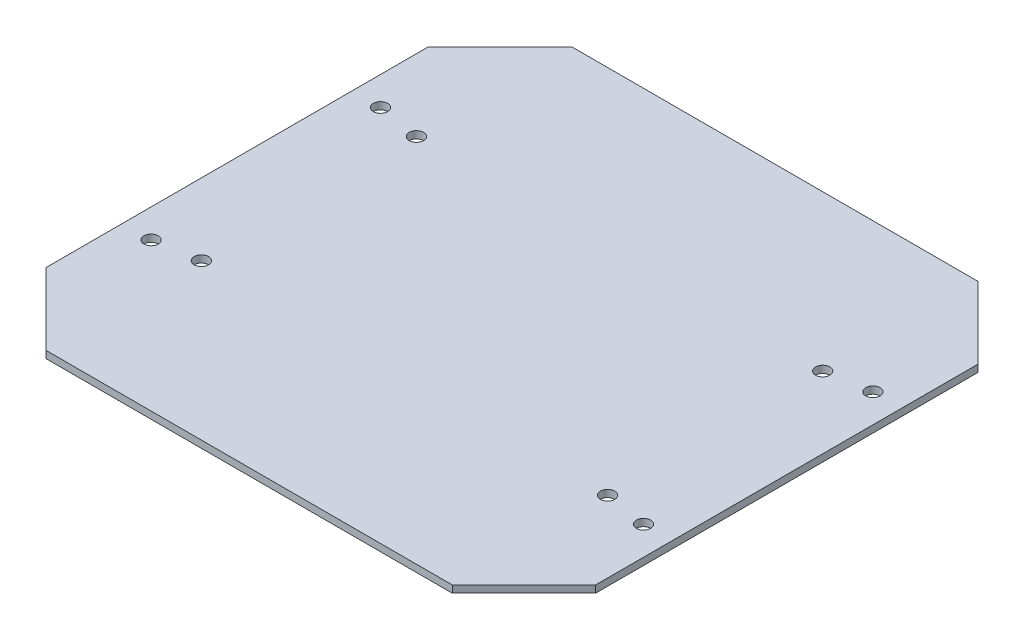
ISO-10303-21;
HEADER;
FILE_DESCRIPTION(('STEP AP214'),'2;1');
FILE_NAME('part.step','',(''),(''),'','','');
FILE_SCHEMA(('AUTOMOTIVE_DESIGN { 1 0 10303 214 1 1 1 1 }'));
ENDSEC;
DATA;
#1=APPLICATION_CONTEXT('core data for automotive mechanical design processes');
#2=APPLICATION_PROTOCOL_DEFINITION('international standard','automotive_design',2000,#1);
#3=PRODUCT_CONTEXT('',#1,'mechanical');
#4=PRODUCT('Part','Part','',(#3));
#5=PRODUCT_RELATED_PRODUCT_CATEGORY('part','',(#4));
#6=PRODUCT_DEFINITION_FORMATION('','',#4);
#7=PRODUCT_DEFINITION_CONTEXT('part definition',#1,'design');
#8=PRODUCT_DEFINITION('design','',#6,#7);
#9=PRODUCT_DEFINITION_SHAPE('','',#8);
#10=(LENGTH_UNIT() NAMED_UNIT(*) SI_UNIT(.MILLI.,.METRE.));
#11=(NAMED_UNIT(*) PLANE_ANGLE_UNIT() SI_UNIT($,.RADIAN.));
#12=(NAMED_UNIT(*) SI_UNIT($,.STERADIAN.) SOLID_ANGLE_UNIT());
#13=UNCERTAINTY_MEASURE_WITH_UNIT(LENGTH_MEASURE(1.E-05),#10,'distance_accuracy_value','');
#14=(GEOMETRIC_REPRESENTATION_CONTEXT(3) GLOBAL_UNCERTAINTY_ASSIGNED_CONTEXT((#13)) GLOBAL_UNIT_ASSIGNED_CONTEXT((#10,
#11,#12)) REPRESENTATION_CONTEXT('',''));
#15=CARTESIAN_POINT('',(0.,0.,0.));
#16=DIRECTION('',(0.,0.,1.));
#17=DIRECTION('',(1.,0.,0.));
#18=AXIS2_PLACEMENT_3D('',#15,#16,#17);
#19=CARTESIAN_POINT('',(57.5,1.5,55.));
#20=DIRECTION('',(-1.,0.,0.));
#21=DIRECTION('',(0.,0.,1.));
#22=AXIS2_PLACEMENT_3D('',#19,#20,#21);
#23=PLANE('',#22);
#24=DIRECTION('',(0.,0.,-1.));
#25=VECTOR('',#24,1.);
#26=CARTESIAN_POINT('',(57.5,1.5,55.));
#27=LINE('',#26,#25);
#28=CARTESIAN_POINT('',(57.5,1.5,40.));
#29=VERTEX_POINT('',#28);
#30=CARTESIAN_POINT('',(57.5,1.5,-40.));
#31=VERTEX_POINT('',#30);
#32=EDGE_CURVE('E144',#29,#31,#27,.T.);
#33=ORIENTED_EDGE('',*,*,#32,.F.);
#34=DIRECTION('',(0.,-1.,0.));
#35=VECTOR('',#34,1.);
#36=CARTESIAN_POINT('',(57.5,1.5,40.));
#37=LINE('',#36,#35);
#38=CARTESIAN_POINT('',(57.5,0.,40.));
#39=VERTEX_POINT('',#38);
#40=EDGE_CURVE('E183',#29,#39,#37,.T.);
#41=ORIENTED_EDGE('',*,*,#40,.T.);
#42=DIRECTION('',(0.,0.,-1.));
#43=VECTOR('',#42,1.);
#44=CARTESIAN_POINT('',(57.5,0.,55.));
#45=LINE('',#44,#43);
#46=CARTESIAN_POINT('',(57.5,0.,-40.));
#47=VERTEX_POINT('',#46);
#48=EDGE_CURVE('E198',#39,#47,#45,.T.);
#49=ORIENTED_EDGE('',*,*,#48,.T.);
#50=DIRECTION('',(0.,1.,0.));
#51=VECTOR('',#50,1.);
#52=CARTESIAN_POINT('',(57.5,1.5,-40.));
#53=LINE('',#52,#51);
#54=EDGE_CURVE('E180',#47,#31,#53,.T.);
#55=ORIENTED_EDGE('',*,*,#54,.T.);
#56=EDGE_LOOP('',(#33,#41,#49,#55));
#57=FACE_BOUND('',#56,.T.);
#58=ADVANCED_FACE('F47',(#57),#23,.F.);
#59=CARTESIAN_POINT('',(-57.5,1.5,-55.));
#60=DIRECTION('',(0.,0.,1.));
#61=DIRECTION('',(1.,0.,0.));
#62=AXIS2_PLACEMENT_3D('',#59,#60,#61);
#63=PLANE('',#62);
#64=DIRECTION('',(-1.,0.,0.));
#65=VECTOR('',#64,1.);
#66=CARTESIAN_POINT('',(-57.5,1.5,-55.));
#67=LINE('',#66,#65);
#68=CARTESIAN_POINT('',(42.5,1.5,-55.));
#69=VERTEX_POINT('',#68);
#70=CARTESIAN_POINT('',(-42.5,1.5,-55.));
#71=VERTEX_POINT('',#70);
#72=EDGE_CURVE('E149',#69,#71,#67,.T.);
#73=ORIENTED_EDGE('',*,*,#72,.F.);
#74=DIRECTION('',(0.,-1.,0.));
#75=VECTOR('',#74,1.);
#76=CARTESIAN_POINT('',(42.5,1.5,-55.));
#77=LINE('',#76,#75);
#78=CARTESIAN_POINT('',(42.5,0.,-55.));
#79=VERTEX_POINT('',#78);
#80=EDGE_CURVE('E11',#69,#79,#77,.T.);
#81=ORIENTED_EDGE('',*,*,#80,.T.);
#82=DIRECTION('',(-1.,0.,0.));
#83=VECTOR('',#82,1.);
#84=CARTESIAN_POINT('',(-57.5,0.,-55.));
#85=LINE('',#84,#83);
#86=CARTESIAN_POINT('',(-42.5,0.,-55.));
#87=VERTEX_POINT('',#86);
#88=EDGE_CURVE('E151',#79,#87,#85,.T.);
#89=ORIENTED_EDGE('',*,*,#88,.T.);
#90=DIRECTION('',(0.,1.,0.));
#91=VECTOR('',#90,1.);
#92=CARTESIAN_POINT('',(-42.5,1.5,-55.));
#93=LINE('',#92,#91);
#94=EDGE_CURVE('E57',#87,#71,#93,.T.);
#95=ORIENTED_EDGE('',*,*,#94,.T.);
#96=EDGE_LOOP('',(#73,#81,#89,#95));
#97=FACE_BOUND('',#96,.T.);
#98=ADVANCED_FACE('F204',(#97),#63,.F.);
#99=CARTESIAN_POINT('',(-57.5,1.5,55.));
#100=DIRECTION('',(1.,0.,0.));
#101=DIRECTION('',(0.,0.,-1.));
#102=AXIS2_PLACEMENT_3D('',#99,#100,#101);
#103=PLANE('',#102);
#104=DIRECTION('',(0.,0.,1.));
#105=VECTOR('',#104,1.);
#106=CARTESIAN_POINT('',(-57.5,0.,55.));
#107=LINE('',#106,#105);
#108=CARTESIAN_POINT('',(-57.5,0.,-40.));
#109=VERTEX_POINT('',#108);
#110=CARTESIAN_POINT('',(-57.5,0.,40.));
#111=VERTEX_POINT('',#110);
#112=EDGE_CURVE('E145',#109,#111,#107,.T.);
#113=ORIENTED_EDGE('',*,*,#112,.T.);
#114=DIRECTION('',(0.,1.,0.));
#115=VECTOR('',#114,1.);
#116=CARTESIAN_POINT('',(-57.5,1.5,40.));
#117=LINE('',#116,#115);
#118=CARTESIAN_POINT('',(-57.5,1.5,40.));
#119=VERTEX_POINT('',#118);
#120=EDGE_CURVE('E120',#111,#119,#117,.T.);
#121=ORIENTED_EDGE('',*,*,#120,.T.);
#122=DIRECTION('',(0.,0.,1.));
#123=VECTOR('',#122,1.);
#124=CARTESIAN_POINT('',(-57.5,1.5,55.));
#125=LINE('',#124,#123);
#126=CARTESIAN_POINT('',(-57.5,1.5,-40.));
#127=VERTEX_POINT('',#126);
#128=EDGE_CURVE('E189',#127,#119,#125,.T.);
#129=ORIENTED_EDGE('',*,*,#128,.F.);
#130=DIRECTION('',(0.,-1.,0.));
#131=VECTOR('',#130,1.);
#132=CARTESIAN_POINT('',(-57.5,1.5,-40.));
#133=LINE('',#132,#131);
#134=EDGE_CURVE('E126',#127,#109,#133,.T.);
#135=ORIENTED_EDGE('',*,*,#134,.T.);
#136=EDGE_LOOP('',(#113,#121,#129,#135));
#137=FACE_BOUND('',#136,.T.);
#138=ADVANCED_FACE('F211',(#137),#103,.F.);
#139=CARTESIAN_POINT('',(-57.5,1.5,55.));
#140=DIRECTION('',(0.,0.,-1.));
#141=DIRECTION('',(-1.,0.,0.));
#142=AXIS2_PLACEMENT_3D('',#139,#140,#141);
#143=PLANE('',#142);
#144=DIRECTION('',(1.,0.,0.));
#145=VECTOR('',#144,1.);
#146=CARTESIAN_POINT('',(-57.5,1.5,55.));
#147=LINE('',#146,#145);
#148=CARTESIAN_POINT('',(-42.5,1.5,55.));
#149=VERTEX_POINT('',#148);
#150=CARTESIAN_POINT('',(42.5,1.5,55.));
#151=VERTEX_POINT('',#150);
#152=EDGE_CURVE('E136',#149,#151,#147,.T.);
#153=ORIENTED_EDGE('',*,*,#152,.F.);
#154=DIRECTION('',(0.,-1.,0.));
#155=VECTOR('',#154,1.);
#156=CARTESIAN_POINT('',(-42.5,1.5,55.));
#157=LINE('',#156,#155);
#158=CARTESIAN_POINT('',(-42.5,0.,55.));
#159=VERTEX_POINT('',#158);
#160=EDGE_CURVE('E119',#149,#159,#157,.T.);
#161=ORIENTED_EDGE('',*,*,#160,.T.);
#162=DIRECTION('',(1.,0.,0.));
#163=VECTOR('',#162,1.);
#164=CARTESIAN_POINT('',(-57.5,0.,55.));
#165=LINE('',#164,#163);
#166=CARTESIAN_POINT('',(42.5,0.,55.));
#167=VERTEX_POINT('',#166);
#168=EDGE_CURVE('E133',#159,#167,#165,.T.);
#169=ORIENTED_EDGE('',*,*,#168,.T.);
#170=DIRECTION('',(0.,1.,0.));
#171=VECTOR('',#170,1.);
#172=CARTESIAN_POINT('',(42.5,1.5,55.));
#173=LINE('',#172,#171);
#174=EDGE_CURVE('E139',#167,#151,#173,.T.);
#175=ORIENTED_EDGE('',*,*,#174,.T.);
#176=EDGE_LOOP('',(#153,#161,#169,#175));
#177=FACE_BOUND('',#176,.T.);
#178=ADVANCED_FACE('F132',(#177),#143,.F.);
#179=CARTESIAN_POINT('',(0.,1.5,0.));
#180=DIRECTION('',(0.,-1.,0.));
#181=DIRECTION('',(0.,0.,-1.));
#182=AXIS2_PLACEMENT_3D('',#179,#180,#181);
#183=PLANE('',#182);
#184=CARTESIAN_POINT('',(42.5,1.5,-22.5));
#185=DIRECTION('',(0.,1.,0.));
#186=DIRECTION('',(0.,0.,1.));
#187=AXIS2_PLACEMENT_3D('',#184,#185,#186);
#188=CIRCLE('',#187,1.5);
#189=CARTESIAN_POINT('',(42.5,1.5,-21.));
#190=VERTEX_POINT('',#189);
#191=EDGE_CURVE('E336',#190,#190,#188,.T.);
#192=ORIENTED_EDGE('',*,*,#191,.F.);
#193=EDGE_LOOP('',(#192));
#194=FACE_BOUND('',#193,.T.);
#195=CARTESIAN_POINT('',(42.5,1.5,22.5));
#196=DIRECTION('',(0.,1.,0.));
#197=DIRECTION('',(0.,0.,1.));
#198=AXIS2_PLACEMENT_3D('',#195,#196,#197);
#199=CIRCLE('',#198,1.5);
#200=CARTESIAN_POINT('',(42.5,1.5,24.));
#201=VERTEX_POINT('',#200);
#202=EDGE_CURVE('E342',#201,#201,#199,.T.);
#203=ORIENTED_EDGE('',*,*,#202,.F.);
#204=EDGE_LOOP('',(#203));
#205=FACE_BOUND('',#204,.T.);
#206=CARTESIAN_POINT('',(-42.5,1.5,22.5));
#207=DIRECTION('',(0.,1.,0.));
#208=DIRECTION('',(0.,0.,1.));
#209=AXIS2_PLACEMENT_3D('',#206,#207,#208);
#210=CIRCLE('',#209,1.5);
#211=CARTESIAN_POINT('',(-42.5,1.5,24.));
#212=VERTEX_POINT('',#211);
#213=EDGE_CURVE('E335',#212,#212,#210,.T.);
#214=ORIENTED_EDGE('',*,*,#213,.F.);
#215=EDGE_LOOP('',(#214));
#216=FACE_BOUND('',#215,.T.);
#217=CARTESIAN_POINT('',(-42.5,1.5,-22.5));
#218=DIRECTION('',(0.,1.,0.));
#219=DIRECTION('',(0.,0.,1.));
#220=AXIS2_PLACEMENT_3D('',#217,#218,#219);
#221=CIRCLE('',#220,1.5);
#222=CARTESIAN_POINT('',(-42.5,1.5,-21.));
#223=VERTEX_POINT('',#222);
#224=EDGE_CURVE('E331',#223,#223,#221,.T.);
#225=ORIENTED_EDGE('',*,*,#224,.F.);
#226=EDGE_LOOP('',(#225));
#227=FACE_BOUND('',#226,.T.);
#228=CARTESIAN_POINT('',(-51.515,1.5,24.));
#229=DIRECTION('',(0.,1.,0.));
#230=DIRECTION('',(0.,0.,1.));
#231=AXIS2_PLACEMENT_3D('',#228,#229,#230);
#232=CIRCLE('',#231,1.5);
#233=CARTESIAN_POINT('',(-51.515,1.5,25.5));
#234=VERTEX_POINT('',#233);
#235=EDGE_CURVE('E312',#234,#234,#232,.T.);
#236=ORIENTED_EDGE('',*,*,#235,.F.);
#237=EDGE_LOOP('',(#236));
#238=FACE_BOUND('',#237,.T.);
#239=CARTESIAN_POINT('',(51.515,1.5,24.));
#240=DIRECTION('',(0.,1.,0.));
#241=DIRECTION('',(0.,0.,1.));
#242=AXIS2_PLACEMENT_3D('',#239,#240,#241);
#243=CIRCLE('',#242,1.5);
#244=CARTESIAN_POINT('',(51.515,1.5,25.5));
#245=VERTEX_POINT('',#244);
#246=EDGE_CURVE('E318',#245,#245,#243,.T.);
#247=ORIENTED_EDGE('',*,*,#246,.F.);
#248=EDGE_LOOP('',(#247));
#249=FACE_BOUND('',#248,.T.);
#250=CARTESIAN_POINT('',(51.515,1.5,-24.));
#251=DIRECTION('',(0.,1.,0.));
#252=DIRECTION('',(0.,0.,1.));
#253=AXIS2_PLACEMENT_3D('',#250,#251,#252);
#254=CIRCLE('',#253,1.5);
#255=CARTESIAN_POINT('',(51.515,1.5,-22.5));
#256=VERTEX_POINT('',#255);
#257=EDGE_CURVE('E309',#256,#256,#254,.T.);
#258=ORIENTED_EDGE('',*,*,#257,.F.);
#259=EDGE_LOOP('',(#258));
#260=FACE_BOUND('',#259,.T.);
#261=CARTESIAN_POINT('',(-51.515,1.5,-24.));
#262=DIRECTION('',(0.,1.,0.));
#263=DIRECTION('',(0.,0.,1.));
#264=AXIS2_PLACEMENT_3D('',#261,#262,#263);
#265=CIRCLE('',#264,1.5);
#266=CARTESIAN_POINT('',(-51.515,1.5,-22.5));
#267=VERTEX_POINT('',#266);
#268=EDGE_CURVE('E307',#267,#267,#265,.T.);
#269=ORIENTED_EDGE('',*,*,#268,.F.);
#270=EDGE_LOOP('',(#269));
#271=FACE_BOUND('',#270,.T.);
#272=ORIENTED_EDGE('',*,*,#128,.T.);
#273=DIRECTION('',(-0.707106781186546,0.,-0.707106781186549));
#274=VECTOR('',#273,1.);
#275=CARTESIAN_POINT('',(-42.5,1.5,55.));
#276=LINE('',#275,#274);
#277=EDGE_CURVE('E177',#119,#149,#276,.F.);
#278=ORIENTED_EDGE('',*,*,#277,.T.);
#279=ORIENTED_EDGE('',*,*,#152,.T.);
#280=DIRECTION('',(-0.707106781186549,0.,0.707106781186546));
#281=VECTOR('',#280,1.);
#282=CARTESIAN_POINT('',(57.5,1.5,40.));
#283=LINE('',#282,#281);
#284=EDGE_CURVE('E174',#151,#29,#283,.F.);
#285=ORIENTED_EDGE('',*,*,#284,.T.);
#286=ORIENTED_EDGE('',*,*,#32,.T.);
#287=DIRECTION('',(0.707106781186546,0.,0.707106781186549));
#288=VECTOR('',#287,1.);
#289=CARTESIAN_POINT('',(42.5,1.5,-55.));
#290=LINE('',#289,#288);
#291=EDGE_CURVE('E70',#31,#69,#290,.F.);
#292=ORIENTED_EDGE('',*,*,#291,.T.);
#293=ORIENTED_EDGE('',*,*,#72,.T.);
#294=DIRECTION('',(0.707106781186549,0.,-0.707106781186546));
#295=VECTOR('',#294,1.);
#296=CARTESIAN_POINT('',(-57.5,1.5,-40.));
#297=LINE('',#296,#295);
#298=EDGE_CURVE('E169',#71,#127,#297,.F.);
#299=ORIENTED_EDGE('',*,*,#298,.T.);
#300=EDGE_LOOP('',(#272,#278,#279,#285,#286,#292,#293,#299));
#301=FACE_BOUND('',#300,.T.);
#302=ADVANCED_FACE('F209',(#194,#205,#216,#227,#238,#249,#260,#271,#301),#183,.F.);
#303=CARTESIAN_POINT('',(0.,0.,0.));
#304=DIRECTION('',(0.,-1.,0.));
#305=DIRECTION('',(0.,0.,-1.));
#306=AXIS2_PLACEMENT_3D('',#303,#304,#305);
#307=PLANE('',#306);
#308=CARTESIAN_POINT('',(42.5,0.,-22.5));
#309=DIRECTION('',(0.,-1.,0.));
#310=DIRECTION('',(0.,0.,-1.));
#311=AXIS2_PLACEMENT_3D('',#308,#309,#310);
#312=CIRCLE('',#311,1.5);
#313=CARTESIAN_POINT('',(42.5,0.,-24.));
#314=VERTEX_POINT('',#313);
#315=EDGE_CURVE('E279',#314,#314,#312,.F.);
#316=ORIENTED_EDGE('',*,*,#315,.T.);
#317=EDGE_LOOP('',(#316));
#318=FACE_BOUND('',#317,.T.);
#319=CARTESIAN_POINT('',(42.5,0.,22.5));
#320=DIRECTION('',(0.,-1.,0.));
#321=DIRECTION('',(0.,0.,-1.));
#322=AXIS2_PLACEMENT_3D('',#319,#320,#321);
#323=CIRCLE('',#322,1.5);
#324=CARTESIAN_POINT('',(42.5,0.,21.));
#325=VERTEX_POINT('',#324);
#326=EDGE_CURVE('E283',#325,#325,#323,.F.);
#327=ORIENTED_EDGE('',*,*,#326,.T.);
#328=EDGE_LOOP('',(#327));
#329=FACE_BOUND('',#328,.T.);
#330=CARTESIAN_POINT('',(-42.5,0.,22.5));
#331=DIRECTION('',(0.,-1.,0.));
#332=DIRECTION('',(0.,0.,-1.));
#333=AXIS2_PLACEMENT_3D('',#330,#331,#332);
#334=CIRCLE('',#333,1.5);
#335=CARTESIAN_POINT('',(-42.5,0.,21.));
#336=VERTEX_POINT('',#335);
#337=EDGE_CURVE('E287',#336,#336,#334,.F.);
#338=ORIENTED_EDGE('',*,*,#337,.T.);
#339=EDGE_LOOP('',(#338));
#340=FACE_BOUND('',#339,.T.);
#341=CARTESIAN_POINT('',(-42.5,0.,-22.5));
#342=DIRECTION('',(0.,-1.,0.));
#343=DIRECTION('',(0.,0.,-1.));
#344=AXIS2_PLACEMENT_3D('',#341,#342,#343);
#345=CIRCLE('',#344,1.5);
#346=CARTESIAN_POINT('',(-42.5,0.,-24.));
#347=VERTEX_POINT('',#346);
#348=EDGE_CURVE('E291',#347,#347,#345,.F.);
#349=ORIENTED_EDGE('',*,*,#348,.T.);
#350=EDGE_LOOP('',(#349));
#351=FACE_BOUND('',#350,.T.);
#352=CARTESIAN_POINT('',(-51.515,0.,24.));
#353=DIRECTION('',(0.,-1.,0.));
#354=DIRECTION('',(0.,0.,-1.));
#355=AXIS2_PLACEMENT_3D('',#352,#353,#354);
#356=CIRCLE('',#355,1.5);
#357=CARTESIAN_POINT('',(-51.515,0.,22.5));
#358=VERTEX_POINT('',#357);
#359=EDGE_CURVE('E295',#358,#358,#356,.F.);
#360=ORIENTED_EDGE('',*,*,#359,.T.);
#361=EDGE_LOOP('',(#360));
#362=FACE_BOUND('',#361,.T.);
#363=CARTESIAN_POINT('',(51.515,0.,24.));
#364=DIRECTION('',(0.,-1.,0.));
#365=DIRECTION('',(0.,0.,-1.));
#366=AXIS2_PLACEMENT_3D('',#363,#364,#365);
#367=CIRCLE('',#366,1.5);
#368=CARTESIAN_POINT('',(51.515,0.,22.5));
#369=VERTEX_POINT('',#368);
#370=EDGE_CURVE('E299',#369,#369,#367,.F.);
#371=ORIENTED_EDGE('',*,*,#370,.T.);
#372=EDGE_LOOP('',(#371));
#373=FACE_BOUND('',#372,.T.);
#374=CARTESIAN_POINT('',(51.515,0.,-24.));
#375=DIRECTION('',(0.,-1.,0.));
#376=DIRECTION('',(0.,0.,-1.));
#377=AXIS2_PLACEMENT_3D('',#374,#375,#376);
#378=CIRCLE('',#377,1.5);
#379=CARTESIAN_POINT('',(51.515,0.,-25.5));
#380=VERTEX_POINT('',#379);
#381=EDGE_CURVE('E303',#380,#380,#378,.F.);
#382=ORIENTED_EDGE('',*,*,#381,.T.);
#383=EDGE_LOOP('',(#382));
#384=FACE_BOUND('',#383,.T.);
#385=CARTESIAN_POINT('',(-51.515,0.,-24.));
#386=DIRECTION('',(0.,-1.,0.));
#387=DIRECTION('',(0.,0.,-1.));
#388=AXIS2_PLACEMENT_3D('',#385,#386,#387);
#389=CIRCLE('',#388,1.5);
#390=CARTESIAN_POINT('',(-51.515,0.,-25.5));
#391=VERTEX_POINT('',#390);
#392=EDGE_CURVE('E201',#391,#391,#389,.F.);
#393=ORIENTED_EDGE('',*,*,#392,.T.);
#394=EDGE_LOOP('',(#393));
#395=FACE_BOUND('',#394,.T.);
#396=ORIENTED_EDGE('',*,*,#168,.F.);
#397=DIRECTION('',(0.707106781186546,0.,0.707106781186549));
#398=VECTOR('',#397,1.);
#399=CARTESIAN_POINT('',(-48.7500000000001,0.,48.7499999999999));
#400=LINE('',#399,#398);
#401=EDGE_CURVE('E115',#159,#111,#400,.F.);
#402=ORIENTED_EDGE('',*,*,#401,.T.);
#403=ORIENTED_EDGE('',*,*,#112,.F.);
#404=DIRECTION('',(-0.707106781186549,0.,0.707106781186546));
#405=VECTOR('',#404,1.);
#406=CARTESIAN_POINT('',(-48.7499999999999,0.,-48.7500000000001));
#407=LINE('',#406,#405);
#408=EDGE_CURVE('E138',#109,#87,#407,.F.);
#409=ORIENTED_EDGE('',*,*,#408,.T.);
#410=ORIENTED_EDGE('',*,*,#88,.F.);
#411=DIRECTION('',(-0.707106781186546,0.,-0.707106781186549));
#412=VECTOR('',#411,1.);
#413=CARTESIAN_POINT('',(48.7500000000001,0.,-48.7499999999999));
#414=LINE('',#413,#412);
#415=EDGE_CURVE('E159',#79,#47,#414,.F.);
#416=ORIENTED_EDGE('',*,*,#415,.T.);
#417=ORIENTED_EDGE('',*,*,#48,.F.);
#418=DIRECTION('',(0.707106781186549,0.,-0.707106781186546));
#419=VECTOR('',#418,1.);
#420=CARTESIAN_POINT('',(48.7499999999999,0.,48.7500000000001));
#421=LINE('',#420,#419);
#422=EDGE_CURVE('E127',#39,#167,#421,.F.);
#423=ORIENTED_EDGE('',*,*,#422,.T.);
#424=EDGE_LOOP('',(#396,#402,#403,#409,#410,#416,#417,#423));
#425=FACE_BOUND('',#424,.T.);
#426=ADVANCED_FACE('F141',(#318,#329,#340,#351,#362,#373,#384,#395,#425),#307,.T.);
#427=CARTESIAN_POINT('',(-42.5,1.5,55.));
#428=DIRECTION('',(0.707106781186549,0.,-0.707106781186546));
#429=DIRECTION('',(0.,-1.,0.));
#430=AXIS2_PLACEMENT_3D('',#427,#428,#429);
#431=PLANE('',#430);
#432=ORIENTED_EDGE('',*,*,#277,.F.);
#433=ORIENTED_EDGE('',*,*,#120,.F.);
#434=ORIENTED_EDGE('',*,*,#401,.F.);
#435=ORIENTED_EDGE('',*,*,#160,.F.);
#436=EDGE_LOOP('',(#432,#433,#434,#435));
#437=FACE_BOUND('',#436,.T.);
#438=ADVANCED_FACE('F118',(#437),#431,.F.);
#439=CARTESIAN_POINT('',(57.5,1.5,40.));
#440=DIRECTION('',(-0.707106781186546,0.,-0.707106781186549));
#441=DIRECTION('',(0.,-1.,0.));
#442=AXIS2_PLACEMENT_3D('',#439,#440,#441);
#443=PLANE('',#442);
#444=ORIENTED_EDGE('',*,*,#284,.F.);
#445=ORIENTED_EDGE('',*,*,#174,.F.);
#446=ORIENTED_EDGE('',*,*,#422,.F.);
#447=ORIENTED_EDGE('',*,*,#40,.F.);
#448=EDGE_LOOP('',(#444,#445,#446,#447));
#449=FACE_BOUND('',#448,.T.);
#450=ADVANCED_FACE('F233',(#449),#443,.F.);
#451=CARTESIAN_POINT('',(42.5,1.5,-55.));
#452=DIRECTION('',(-0.707106781186549,0.,0.707106781186546));
#453=DIRECTION('',(0.,-1.,0.));
#454=AXIS2_PLACEMENT_3D('',#451,#452,#453);
#455=PLANE('',#454);
#456=ORIENTED_EDGE('',*,*,#291,.F.);
#457=ORIENTED_EDGE('',*,*,#54,.F.);
#458=ORIENTED_EDGE('',*,*,#415,.F.);
#459=ORIENTED_EDGE('',*,*,#80,.F.);
#460=EDGE_LOOP('',(#456,#457,#458,#459));
#461=FACE_BOUND('',#460,.T.);
#462=ADVANCED_FACE('F238',(#461),#455,.F.);
#463=CARTESIAN_POINT('',(-57.5,1.5,-40.));
#464=DIRECTION('',(0.707106781186546,0.,0.707106781186549));
#465=DIRECTION('',(0.,-1.,0.));
#466=AXIS2_PLACEMENT_3D('',#463,#464,#465);
#467=PLANE('',#466);
#468=ORIENTED_EDGE('',*,*,#298,.F.);
#469=ORIENTED_EDGE('',*,*,#94,.F.);
#470=ORIENTED_EDGE('',*,*,#408,.F.);
#471=ORIENTED_EDGE('',*,*,#134,.F.);
#472=EDGE_LOOP('',(#468,#469,#470,#471));
#473=FACE_BOUND('',#472,.T.);
#474=ADVANCED_FACE('F50',(#473),#467,.F.);
#475=CARTESIAN_POINT('',(-51.515,-4.24264068711929,-24.));
#476=DIRECTION('',(0.,1.,0.));
#477=DIRECTION('',(0.,0.,1.));
#478=AXIS2_PLACEMENT_3D('',#475,#476,#477);
#479=CYLINDRICAL_SURFACE('',#478,1.5);
#480=ORIENTED_EDGE('',*,*,#268,.T.);
#481=EDGE_LOOP('',(#480));
#482=FACE_BOUND('',#481,.T.);
#483=ORIENTED_EDGE('',*,*,#392,.F.);
#484=EDGE_LOOP('',(#483));
#485=FACE_BOUND('',#484,.T.);
#486=ADVANCED_FACE('F247',(#482,#485),#479,.F.);
#487=CARTESIAN_POINT('',(51.515,-4.24264068711929,-24.));
#488=DIRECTION('',(0.,1.,0.));
#489=DIRECTION('',(0.,0.,1.));
#490=AXIS2_PLACEMENT_3D('',#487,#488,#489);
#491=CYLINDRICAL_SURFACE('',#490,1.5);
#492=ORIENTED_EDGE('',*,*,#257,.T.);
#493=EDGE_LOOP('',(#492));
#494=FACE_BOUND('',#493,.T.);
#495=ORIENTED_EDGE('',*,*,#381,.F.);
#496=EDGE_LOOP('',(#495));
#497=FACE_BOUND('',#496,.T.);
#498=ADVANCED_FACE('F254',(#494,#497),#491,.F.);
#499=CARTESIAN_POINT('',(51.515,-4.24264068711929,24.));
#500=DIRECTION('',(0.,1.,0.));
#501=DIRECTION('',(0.,0.,1.));
#502=AXIS2_PLACEMENT_3D('',#499,#500,#501);
#503=CYLINDRICAL_SURFACE('',#502,1.5);
#504=ORIENTED_EDGE('',*,*,#246,.T.);
#505=EDGE_LOOP('',(#504));
#506=FACE_BOUND('',#505,.T.);
#507=ORIENTED_EDGE('',*,*,#370,.F.);
#508=EDGE_LOOP('',(#507));
#509=FACE_BOUND('',#508,.T.);
#510=ADVANCED_FACE('F260',(#506,#509),#503,.F.);
#511=CARTESIAN_POINT('',(-51.515,-4.24264068711929,24.));
#512=DIRECTION('',(0.,1.,0.));
#513=DIRECTION('',(0.,0.,1.));
#514=AXIS2_PLACEMENT_3D('',#511,#512,#513);
#515=CYLINDRICAL_SURFACE('',#514,1.5);
#516=ORIENTED_EDGE('',*,*,#235,.T.);
#517=EDGE_LOOP('',(#516));
#518=FACE_BOUND('',#517,.T.);
#519=ORIENTED_EDGE('',*,*,#359,.F.);
#520=EDGE_LOOP('',(#519));
#521=FACE_BOUND('',#520,.T.);
#522=ADVANCED_FACE('F267',(#518,#521),#515,.F.);
#523=CARTESIAN_POINT('',(-42.5,-4.24264068711929,-22.5));
#524=DIRECTION('',(0.,1.,0.));
#525=DIRECTION('',(0.,0.,1.));
#526=AXIS2_PLACEMENT_3D('',#523,#524,#525);
#527=CYLINDRICAL_SURFACE('',#526,1.5);
#528=ORIENTED_EDGE('',*,*,#224,.T.);
#529=EDGE_LOOP('',(#528));
#530=FACE_BOUND('',#529,.T.);
#531=ORIENTED_EDGE('',*,*,#348,.F.);
#532=EDGE_LOOP('',(#531));
#533=FACE_BOUND('',#532,.T.);
#534=ADVANCED_FACE('F374',(#530,#533),#527,.F.);
#535=CARTESIAN_POINT('',(-42.5,-4.24264068711929,22.5));
#536=DIRECTION('',(0.,1.,0.));
#537=DIRECTION('',(0.,0.,1.));
#538=AXIS2_PLACEMENT_3D('',#535,#536,#537);
#539=CYLINDRICAL_SURFACE('',#538,1.5);
#540=ORIENTED_EDGE('',*,*,#213,.T.);
#541=EDGE_LOOP('',(#540));
#542=FACE_BOUND('',#541,.T.);
#543=ORIENTED_EDGE('',*,*,#337,.F.);
#544=EDGE_LOOP('',(#543));
#545=FACE_BOUND('',#544,.T.);
#546=ADVANCED_FACE('F354',(#542,#545),#539,.F.);
#547=CARTESIAN_POINT('',(42.5,-4.24264068711929,22.5));
#548=DIRECTION('',(0.,1.,0.));
#549=DIRECTION('',(0.,0.,1.));
#550=AXIS2_PLACEMENT_3D('',#547,#548,#549);
#551=CYLINDRICAL_SURFACE('',#550,1.5);
#552=ORIENTED_EDGE('',*,*,#202,.T.);
#553=EDGE_LOOP('',(#552));
#554=FACE_BOUND('',#553,.T.);
#555=ORIENTED_EDGE('',*,*,#326,.F.);
#556=EDGE_LOOP('',(#555));
#557=FACE_BOUND('',#556,.T.);
#558=ADVANCED_FACE('F383',(#554,#557),#551,.F.);
#559=CARTESIAN_POINT('',(42.5,-4.24264068711929,-22.5));
#560=DIRECTION('',(0.,1.,0.));
#561=DIRECTION('',(0.,0.,1.));
#562=AXIS2_PLACEMENT_3D('',#559,#560,#561);
#563=CYLINDRICAL_SURFACE('',#562,1.5);
#564=ORIENTED_EDGE('',*,*,#191,.T.);
#565=EDGE_LOOP('',(#564));
#566=FACE_BOUND('',#565,.T.);
#567=ORIENTED_EDGE('',*,*,#315,.F.);
#568=EDGE_LOOP('',(#567));
#569=FACE_BOUND('',#568,.T.);
#570=ADVANCED_FACE('F380',(#566,#569),#563,.F.);
#571=CLOSED_SHELL('',(#58,#98,#138,#178,#302,#426,#438,#450,#462,#474,#486,#498,#510,#522,#534,
#546,#558,#570));
#572=MANIFOLD_SOLID_BREP('B2',#571);
#573=ADVANCED_BREP_SHAPE_REPRESENTATION('',(#18,#572),#14);
#574=SHAPE_DEFINITION_REPRESENTATION(#9,#573);
ENDSEC;
END-ISO-10303-21;
